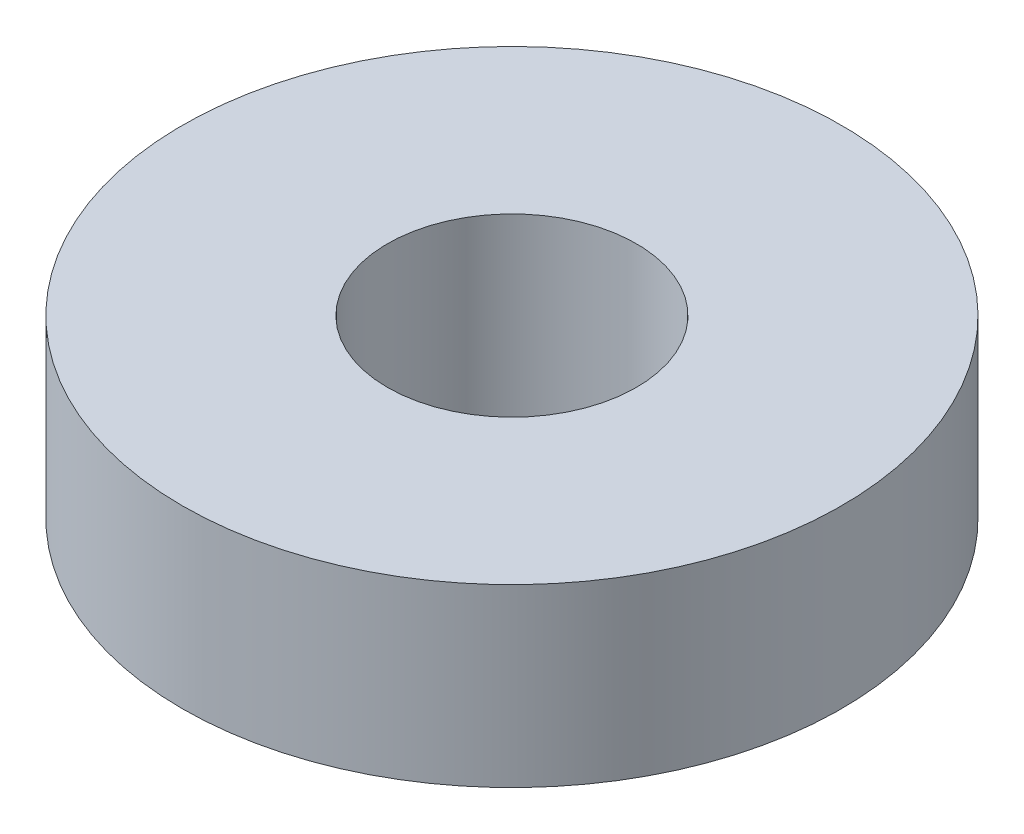
ISO-10303-21;
HEADER;
FILE_DESCRIPTION(('STEP AP214'),'2;1');
FILE_NAME('part.step','',(''),(''),'','','');
FILE_SCHEMA(('AUTOMOTIVE_DESIGN { 1 0 10303 214 1 1 1 1 }'));
ENDSEC;
DATA;
#1=APPLICATION_CONTEXT('core data for automotive mechanical design processes');
#2=APPLICATION_PROTOCOL_DEFINITION('international standard','automotive_design',2000,#1);
#3=PRODUCT_CONTEXT('',#1,'mechanical');
#4=PRODUCT('Part','Part','',(#3));
#5=PRODUCT_RELATED_PRODUCT_CATEGORY('part','',(#4));
#6=PRODUCT_DEFINITION_FORMATION('','',#4);
#7=PRODUCT_DEFINITION_CONTEXT('part definition',#1,'design');
#8=PRODUCT_DEFINITION('design','',#6,#7);
#9=PRODUCT_DEFINITION_SHAPE('','',#8);
#10=(LENGTH_UNIT() NAMED_UNIT(*) SI_UNIT(.MILLI.,.METRE.));
#11=(NAMED_UNIT(*) PLANE_ANGLE_UNIT() SI_UNIT($,.RADIAN.));
#12=(NAMED_UNIT(*) SI_UNIT($,.STERADIAN.) SOLID_ANGLE_UNIT());
#13=UNCERTAINTY_MEASURE_WITH_UNIT(LENGTH_MEASURE(1.E-05),#10,'distance_accuracy_value','');
#14=(GEOMETRIC_REPRESENTATION_CONTEXT(3) GLOBAL_UNCERTAINTY_ASSIGNED_CONTEXT((#13)) GLOBAL_UNIT_ASSIGNED_CONTEXT((#10,
#11,#12)) REPRESENTATION_CONTEXT('',''));
#15=CARTESIAN_POINT('',(0.,0.,0.));
#16=DIRECTION('',(0.,0.,1.));
#17=DIRECTION('',(1.,0.,0.));
#18=AXIS2_PLACEMENT_3D('',#15,#16,#17);
#19=CARTESIAN_POINT('',(0.,12.,0.));
#20=DIRECTION('',(0.,1.,0.));
#21=DIRECTION('',(0.,0.,1.));
#22=AXIS2_PLACEMENT_3D('',#19,#20,#21);
#23=PLANE('',#22);
#24=CARTESIAN_POINT('',(0.,12.,0.));
#25=DIRECTION('',(0.,1.,0.));
#26=DIRECTION('',(0.,0.,1.));
#27=AXIS2_PLACEMENT_3D('',#24,#25,#26);
#28=CIRCLE('',#27,22.5);
#29=CARTESIAN_POINT('',(0.,12.,22.5));
#30=VERTEX_POINT('',#29);
#31=EDGE_CURVE('E10',#30,#30,#28,.T.);
#32=ORIENTED_EDGE('',*,*,#31,.T.);
#33=EDGE_LOOP('',(#32));
#34=FACE_BOUND('',#33,.T.);
#35=CARTESIAN_POINT('',(0.,12.,0.));
#36=DIRECTION('',(0.,1.,0.));
#37=DIRECTION('',(0.,0.,1.));
#38=AXIS2_PLACEMENT_3D('',#35,#36,#37);
#39=CIRCLE('',#38,8.5);
#40=CARTESIAN_POINT('',(0.,12.,8.5));
#41=VERTEX_POINT('',#40);
#42=EDGE_CURVE('E42',#41,#41,#39,.T.);
#43=ORIENTED_EDGE('',*,*,#42,.F.);
#44=EDGE_LOOP('',(#43));
#45=FACE_BOUND('',#44,.T.);
#46=ADVANCED_FACE('F31',(#34,#45),#23,.T.);
#47=CARTESIAN_POINT('',(0.,0.,0.));
#48=DIRECTION('',(0.,1.,0.));
#49=DIRECTION('',(0.,0.,1.));
#50=AXIS2_PLACEMENT_3D('',#47,#48,#49);
#51=PLANE('',#50);
#52=CARTESIAN_POINT('',(0.,0.,0.));
#53=DIRECTION('',(0.,1.,0.));
#54=DIRECTION('',(0.,0.,1.));
#55=AXIS2_PLACEMENT_3D('',#52,#53,#54);
#56=CIRCLE('',#55,22.5);
#57=CARTESIAN_POINT('',(0.,0.,22.5));
#58=VERTEX_POINT('',#57);
#59=EDGE_CURVE('E35',#58,#58,#56,.T.);
#60=ORIENTED_EDGE('',*,*,#59,.F.);
#61=EDGE_LOOP('',(#60));
#62=FACE_BOUND('',#61,.T.);
#63=CARTESIAN_POINT('',(0.,0.,0.));
#64=DIRECTION('',(0.,1.,0.));
#65=DIRECTION('',(0.,0.,1.));
#66=AXIS2_PLACEMENT_3D('',#63,#64,#65);
#67=CIRCLE('',#66,8.5);
#68=CARTESIAN_POINT('',(0.,0.,8.5));
#69=VERTEX_POINT('',#68);
#70=EDGE_CURVE('E44',#69,#69,#67,.T.);
#71=ORIENTED_EDGE('',*,*,#70,.T.);
#72=EDGE_LOOP('',(#71));
#73=FACE_BOUND('',#72,.T.);
#74=ADVANCED_FACE('F54',(#62,#73),#51,.F.);
#75=CARTESIAN_POINT('',(0.,12.,0.));
#76=DIRECTION('',(0.,-1.,0.));
#77=DIRECTION('',(0.,0.,-1.));
#78=AXIS2_PLACEMENT_3D('',#75,#76,#77);
#79=CYLINDRICAL_SURFACE('',#78,22.5);
#80=ORIENTED_EDGE('',*,*,#31,.F.);
#81=EDGE_LOOP('',(#80));
#82=FACE_BOUND('',#81,.T.);
#83=ORIENTED_EDGE('',*,*,#59,.T.);
#84=EDGE_LOOP('',(#83));
#85=FACE_BOUND('',#84,.T.);
#86=ADVANCED_FACE('F33',(#82,#85),#79,.T.);
#87=CARTESIAN_POINT('',(0.,12.,0.));
#88=DIRECTION('',(0.,-1.,0.));
#89=DIRECTION('',(0.,0.,-1.));
#90=AXIS2_PLACEMENT_3D('',#87,#88,#89);
#91=CYLINDRICAL_SURFACE('',#90,8.5);
#92=ORIENTED_EDGE('',*,*,#42,.T.);
#93=EDGE_LOOP('',(#92));
#94=FACE_BOUND('',#93,.T.);
#95=ORIENTED_EDGE('',*,*,#70,.F.);
#96=EDGE_LOOP('',(#95));
#97=FACE_BOUND('',#96,.T.);
#98=ADVANCED_FACE('F50',(#94,#97),#91,.F.);
#99=CLOSED_SHELL('',(#46,#74,#86,#98));
#100=MANIFOLD_SOLID_BREP('B2',#99);
#101=ADVANCED_BREP_SHAPE_REPRESENTATION('',(#18,#100),#14);
#102=SHAPE_DEFINITION_REPRESENTATION(#9,#101);
ENDSEC;
END-ISO-10303-21;
